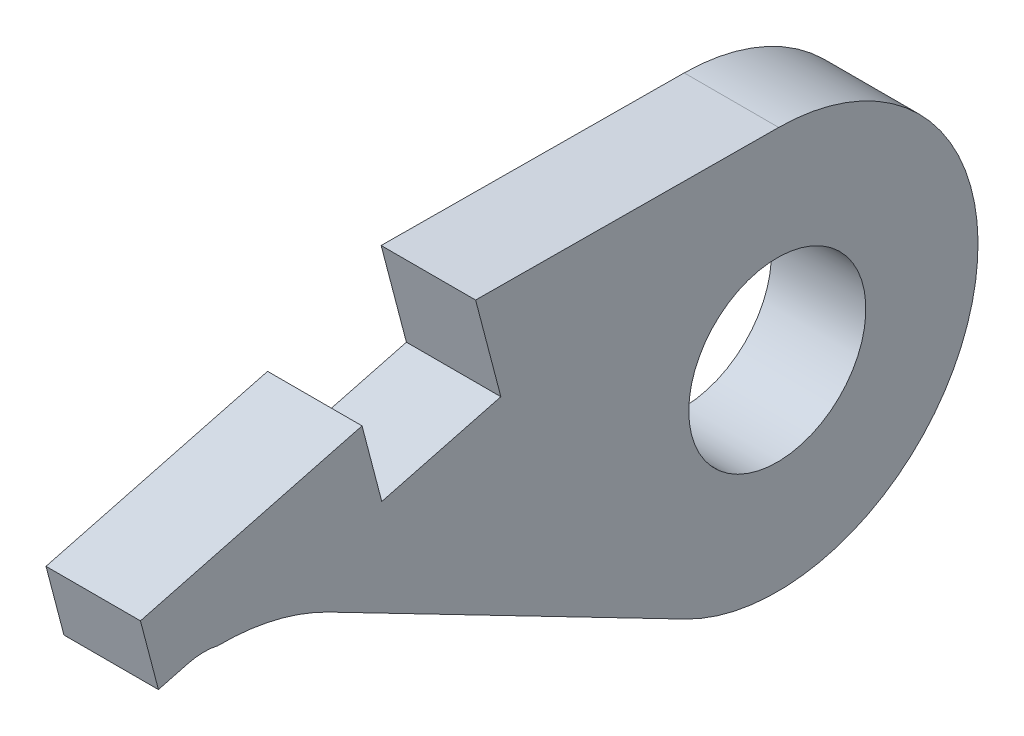
ISO-10303-21;
HEADER;
FILE_DESCRIPTION(('STEP AP214'),'2;1');
FILE_NAME('part.step','',(''),(''),'','','');
FILE_SCHEMA(('AUTOMOTIVE_DESIGN { 1 0 10303 214 1 1 1 1 }'));
ENDSEC;
DATA;
#1=APPLICATION_CONTEXT('core data for automotive mechanical design processes');
#2=APPLICATION_PROTOCOL_DEFINITION('international standard','automotive_design',2000,#1);
#3=PRODUCT_CONTEXT('',#1,'mechanical');
#4=PRODUCT('Part','Part','',(#3));
#5=PRODUCT_RELATED_PRODUCT_CATEGORY('part','',(#4));
#6=PRODUCT_DEFINITION_FORMATION('','',#4);
#7=PRODUCT_DEFINITION_CONTEXT('part definition',#1,'design');
#8=PRODUCT_DEFINITION('design','',#6,#7);
#9=PRODUCT_DEFINITION_SHAPE('','',#8);
#10=(LENGTH_UNIT() NAMED_UNIT(*) SI_UNIT(.MILLI.,.METRE.));
#11=(NAMED_UNIT(*) PLANE_ANGLE_UNIT() SI_UNIT($,.RADIAN.));
#12=(NAMED_UNIT(*) SI_UNIT($,.STERADIAN.) SOLID_ANGLE_UNIT());
#13=UNCERTAINTY_MEASURE_WITH_UNIT(LENGTH_MEASURE(1.E-05),#10,'distance_accuracy_value','');
#14=(GEOMETRIC_REPRESENTATION_CONTEXT(3) GLOBAL_UNCERTAINTY_ASSIGNED_CONTEXT((#13)) GLOBAL_UNIT_ASSIGNED_CONTEXT((#10,
#11,#12)) REPRESENTATION_CONTEXT('',''));
#15=CARTESIAN_POINT('',(0.,0.,0.));
#16=DIRECTION('',(0.,0.,1.));
#17=DIRECTION('',(1.,0.,0.));
#18=AXIS2_PLACEMENT_3D('',#15,#16,#17);
#19=CARTESIAN_POINT('',(-316.6,-79.0881001747443,-30.7514619286567));
#20=DIRECTION('',(0.,-0.253478701561643,0.967340967733005));
#21=DIRECTION('',(0.,-0.967340967733003,-0.253478701561644));
#22=AXIS2_PLACEMENT_3D('',#19,#20,#21);
#23=PLANE('',#22);
#24=DIRECTION('',(-1.,0.,0.));
#25=VECTOR('',#24,1.);
#26=CARTESIAN_POINT('',(-312.6,-75.8958749812254,-29.9149822135033));
#27=LINE('',#26,#25);
#28=CARTESIAN_POINT('',(-312.6,-75.8958749812254,-29.9149822135033));
#29=VERTEX_POINT('',#28);
#30=CARTESIAN_POINT('',(-316.6,-75.8958749812254,-29.9149822135033));
#31=VERTEX_POINT('',#30);
#32=EDGE_CURVE('E118',#29,#31,#27,.T.);
#33=ORIENTED_EDGE('',*,*,#32,.F.);
#34=DIRECTION('',(0.,0.967340967733003,0.253478701561644));
#35=VECTOR('',#34,1.);
#36=CARTESIAN_POINT('',(-312.6,-79.0881001747443,-30.7514619286567));
#37=LINE('',#36,#35);
#38=CARTESIAN_POINT('',(-312.6,-79.0881001747443,-30.7514619286567));
#39=VERTEX_POINT('',#38);
#40=EDGE_CURVE('E136',#39,#29,#37,.T.);
#41=ORIENTED_EDGE('',*,*,#40,.F.);
#42=DIRECTION('',(1.,0.,0.));
#43=VECTOR('',#42,1.);
#44=CARTESIAN_POINT('',(-316.6,-79.0881001747443,-30.7514619286567));
#45=LINE('',#44,#43);
#46=CARTESIAN_POINT('',(-316.6,-79.0881001747443,-30.7514619286567));
#47=VERTEX_POINT('',#46);
#48=EDGE_CURVE('E135',#47,#39,#45,.T.);
#49=ORIENTED_EDGE('',*,*,#48,.F.);
#50=DIRECTION('',(0.,0.967340967733003,0.253478701561644));
#51=VECTOR('',#50,1.);
#52=CARTESIAN_POINT('',(-316.6,-79.0881001747443,-30.7514619286567));
#53=LINE('',#52,#51);
#54=EDGE_CURVE('E131',#47,#31,#53,.T.);
#55=ORIENTED_EDGE('',*,*,#54,.T.);
#56=EDGE_LOOP('',(#33,#41,#49,#55));
#57=FACE_BOUND('',#56,.T.);
#58=ADVANCED_FACE('F37',(#57),#23,.F.);
#59=CARTESIAN_POINT('',(-312.6,-81.5468435798922,-21.3682545416465));
#60=DIRECTION('',(0.,0.253478701561643,-0.967340967733005));
#61=DIRECTION('',(0.,0.967340967733003,0.253478701561644));
#62=AXIS2_PLACEMENT_3D('',#59,#60,#61);
#63=PLANE('',#62);
#64=DIRECTION('',(1.,0.,0.));
#65=VECTOR('',#64,1.);
#66=CARTESIAN_POINT('',(-316.6,-78.3546183863733,-20.5317748264931));
#67=LINE('',#66,#65);
#68=CARTESIAN_POINT('',(-316.6,-78.3546183863733,-20.5317748264931));
#69=VERTEX_POINT('',#68);
#70=CARTESIAN_POINT('',(-312.6,-78.3546183863733,-20.5317748264931));
#71=VERTEX_POINT('',#70);
#72=EDGE_CURVE('E52',#69,#71,#67,.T.);
#73=ORIENTED_EDGE('',*,*,#72,.F.);
#74=DIRECTION('',(0.,0.967340967733003,0.253478701561644));
#75=VECTOR('',#74,1.);
#76=CARTESIAN_POINT('',(-316.6,-81.5468435798922,-21.3682545416465));
#77=LINE('',#76,#75);
#78=CARTESIAN_POINT('',(-316.6,-81.2566412895722,-21.292210931178));
#79=VERTEX_POINT('',#78);
#80=EDGE_CURVE('E59',#79,#69,#77,.T.);
#81=ORIENTED_EDGE('',*,*,#80,.F.);
#82=DIRECTION('',(-1.,0.,0.));
#83=VECTOR('',#82,1.);
#84=CARTESIAN_POINT('',(-245.763267940061,-81.2566412895722,-21.292210931178));
#85=LINE('',#84,#83);
#86=CARTESIAN_POINT('',(-312.6,-81.2566412895723,-21.292210931178));
#87=VERTEX_POINT('',#86);
#88=EDGE_CURVE('E157',#87,#79,#85,.T.);
#89=ORIENTED_EDGE('',*,*,#88,.F.);
#90=DIRECTION('',(0.,0.967340967733003,0.253478701561644));
#91=VECTOR('',#90,1.);
#92=CARTESIAN_POINT('',(-312.6,-81.5468435798922,-21.3682545416465));
#93=LINE('',#92,#91);
#94=EDGE_CURVE('E140',#87,#71,#93,.T.);
#95=ORIENTED_EDGE('',*,*,#94,.T.);
#96=EDGE_LOOP('',(#73,#81,#89,#95));
#97=FACE_BOUND('',#96,.T.);
#98=ADVANCED_FACE('F241',(#97),#63,.F.);
#99=CARTESIAN_POINT('',(-316.6,-82.272413359522,-47.4999999999995));
#100=DIRECTION('',(-1.,0.,0.));
#101=DIRECTION('',(0.,0.,1.));
#102=AXIS2_PLACEMENT_3D('',#99,#100,#101);
#103=PLANE('',#102);
#104=CARTESIAN_POINT('',(-316.6,-82.272413359522,-47.4999999999995));
#105=DIRECTION('',(-1.,0.,0.));
#106=DIRECTION('',(0.,0.,1.));
#107=AXIS2_PLACEMENT_3D('',#104,#105,#106);
#108=CIRCLE('',#107,3.75000000000001);
#109=CARTESIAN_POINT('',(-316.6,-82.272413359522,-43.7499999999995));
#110=VERTEX_POINT('',#109);
#111=EDGE_CURVE('E165',#110,#110,#108,.T.);
#112=ORIENTED_EDGE('',*,*,#111,.F.);
#113=EDGE_LOOP('',(#112));
#114=FACE_BOUND('',#113,.T.);
#115=ORIENTED_EDGE('',*,*,#80,.T.);
#116=DIRECTION('',(0.,-0.253478701561645,0.967340967733003));
#117=VECTOR('',#116,1.);
#118=CARTESIAN_POINT('',(-316.6,-75.8958749812254,-29.9149822135033));
#119=LINE('',#118,#117);
#120=EDGE_CURVE('E121',#31,#69,#119,.T.);
#121=ORIENTED_EDGE('',*,*,#120,.F.);
#122=ORIENTED_EDGE('',*,*,#54,.F.);
#123=DIRECTION('',(0.,-0.253478701561643,0.967340967733005));
#124=VECTOR('',#123,1.);
#125=CARTESIAN_POINT('',(-316.6,-75.1859498174999,-45.6430874560128));
#126=LINE('',#125,#124);
#127=CARTESIAN_POINT('',(-316.6,-77.7668432160323,-35.7937237723151));
#128=VERTEX_POINT('',#127);
#129=EDGE_CURVE('E147',#128,#47,#126,.T.);
#130=ORIENTED_EDGE('',*,*,#129,.F.);
#131=DIRECTION('',(0.,0.967340967733003,0.253478701561644));
#132=VECTOR('',#131,1.);
#133=CARTESIAN_POINT('',(-316.6,-84.8533067580544,-37.6506363163018));
#134=LINE('',#133,#132);
#135=CARTESIAN_POINT('',(-316.6,-73.685431134597,-34.7242445819891));
#136=VERTEX_POINT('',#135);
#137=EDGE_CURVE('E11',#128,#136,#134,.T.);
#138=ORIENTED_EDGE('',*,*,#137,.T.);
#139=DIRECTION('',(0.,-0.00679287483221677,-0.999976928159604));
#140=VECTOR('',#139,1.);
#141=CARTESIAN_POINT('',(-316.6,-73.6833206652489,-34.4135630652801));
#142=LINE('',#141,#140);
#143=CARTESIAN_POINT('',(-316.6,-73.7726094701653,-47.5577394360733));
#144=VERTEX_POINT('',#143);
#145=EDGE_CURVE('E182',#136,#144,#142,.T.);
#146=ORIENTED_EDGE('',*,*,#145,.T.);
#147=CARTESIAN_POINT('',(-316.6,-82.272413359522,-47.4999999999995));
#148=DIRECTION('',(-1.,0.,0.));
#149=DIRECTION('',(0.,0.,1.));
#150=AXIS2_PLACEMENT_3D('',#147,#148,#149);
#151=CIRCLE('',#150,8.50000000000001);
#152=CARTESIAN_POINT('',(-316.6,-89.8228577595626,-43.5960546415326));
#153=VERTEX_POINT('',#152);
#154=EDGE_CURVE('E184',#144,#153,#151,.T.);
#155=ORIENTED_EDGE('',*,*,#154,.T.);
#156=DIRECTION('',(0.,0.459287689231397,0.88828757647537));
#157=VECTOR('',#156,1.);
#158=CARTESIAN_POINT('',(-316.6,-82.0232489787974,-28.5111835601495));
#159=LINE('',#158,#157);
#160=CARTESIAN_POINT('',(-316.6,-82.0232489787974,-28.5111835601495));
#161=VERTEX_POINT('',#160);
#162=EDGE_CURVE('E187',#153,#161,#159,.T.);
#163=ORIENTED_EDGE('',*,*,#162,.T.);
#164=CARTESIAN_POINT('',(-316.6,-90.9061247435511,-23.9183066678356));
#165=DIRECTION('',(1.,0.,0.));
#166=DIRECTION('',(0.,0.,-1.));
#167=AXIS2_PLACEMENT_3D('',#164,#165,#166);
#168=CIRCLE('',#167,9.99999999999999);
#169=CARTESIAN_POINT('',(-316.6,-80.9066981729876,-23.8112167060803));
#170=VERTEX_POINT('',#169);
#171=EDGE_CURVE('E166',#161,#170,#168,.T.);
#172=ORIENTED_EDGE('',*,*,#171,.T.);
#173=CARTESIAN_POINT('',(-316.6,-83.4389089915924,-23.2213791266226));
#174=DIRECTION('',(-1.,0.,0.));
#175=DIRECTION('',(0.,0.,1.));
#176=AXIS2_PLACEMENT_3D('',#173,#174,#175);
#177=CIRCLE('',#176,2.6);
#178=CARTESIAN_POINT('',(-316.6,-80.9238224754866,-22.5623345025624));
#179=VERTEX_POINT('',#178);
#180=EDGE_CURVE('E162',#170,#179,#177,.F.);
#181=ORIENTED_EDGE('',*,*,#180,.T.);
#182=DIRECTION('',(0.,-0.253478701561643,0.967340967733005));
#183=VECTOR('',#182,1.);
#184=CARTESIAN_POINT('',(-316.6,-77.5526845361809,-35.4274778715267));
#185=LINE('',#184,#183);
#186=EDGE_CURVE('E145',#179,#79,#185,.T.);
#187=ORIENTED_EDGE('',*,*,#186,.T.);
#188=EDGE_LOOP('',(#115,#121,#122,#130,#138,#146,#155,#163,#172,#181,#187));
#189=FACE_BOUND('',#188,.T.);
#190=ADVANCED_FACE('F129',(#114,#189),#103,.T.);
#191=CARTESIAN_POINT('',(-312.6,-82.272413359522,-47.4999999999995));
#192=DIRECTION('',(-1.,0.,0.));
#193=DIRECTION('',(0.,0.,1.));
#194=AXIS2_PLACEMENT_3D('',#191,#192,#193);
#195=PLANE('',#194);
#196=CARTESIAN_POINT('',(-312.6,-82.272413359522,-47.4999999999995));
#197=DIRECTION('',(-1.,0.,0.));
#198=DIRECTION('',(0.,0.,1.));
#199=AXIS2_PLACEMENT_3D('',#196,#197,#198);
#200=CIRCLE('',#199,3.75000000000001);
#201=CARTESIAN_POINT('',(-312.6,-82.272413359522,-43.7499999999995));
#202=VERTEX_POINT('',#201);
#203=EDGE_CURVE('E160',#202,#202,#200,.T.);
#204=ORIENTED_EDGE('',*,*,#203,.T.);
#205=EDGE_LOOP('',(#204));
#206=FACE_BOUND('',#205,.T.);
#207=DIRECTION('',(0.,0.253478701561646,-0.967340967733003));
#208=VECTOR('',#207,1.);
#209=CARTESIAN_POINT('',(-312.6,-78.3546183863733,-20.5317748264931));
#210=LINE('',#209,#208);
#211=EDGE_CURVE('E122',#71,#29,#210,.T.);
#212=ORIENTED_EDGE('',*,*,#211,.F.);
#213=ORIENTED_EDGE('',*,*,#94,.F.);
#214=DIRECTION('',(0.,0.253478701561643,-0.967340967733005));
#215=VECTOR('',#214,1.);
#216=CARTESIAN_POINT('',(-312.6,-77.5526845361809,-35.4274778715267));
#217=LINE('',#216,#215);
#218=CARTESIAN_POINT('',(-312.6,-80.9238224754866,-22.5623345025624));
#219=VERTEX_POINT('',#218);
#220=EDGE_CURVE('E138',#87,#219,#217,.T.);
#221=ORIENTED_EDGE('',*,*,#220,.T.);
#222=CARTESIAN_POINT('',(-312.6,-83.4389089915924,-23.2213791266226));
#223=DIRECTION('',(-1.,0.,0.));
#224=DIRECTION('',(0.,0.,1.));
#225=AXIS2_PLACEMENT_3D('',#222,#223,#224);
#226=CIRCLE('',#225,2.6);
#227=CARTESIAN_POINT('',(-312.6,-80.9066981729876,-23.8112167060803));
#228=VERTEX_POINT('',#227);
#229=EDGE_CURVE('E158',#219,#228,#226,.T.);
#230=ORIENTED_EDGE('',*,*,#229,.T.);
#231=CARTESIAN_POINT('',(-312.6,-90.9061247435511,-23.9183066678356));
#232=DIRECTION('',(1.,0.,0.));
#233=DIRECTION('',(0.,0.,-1.));
#234=AXIS2_PLACEMENT_3D('',#231,#232,#233);
#235=CIRCLE('',#234,9.99999999999999);
#236=CARTESIAN_POINT('',(-312.6,-82.0232489787974,-28.5111835601495));
#237=VERTEX_POINT('',#236);
#238=EDGE_CURVE('E181',#237,#228,#235,.T.);
#239=ORIENTED_EDGE('',*,*,#238,.F.);
#240=DIRECTION('',(0.,0.459287689231397,0.88828757647537));
#241=VECTOR('',#240,1.);
#242=CARTESIAN_POINT('',(-312.6,-82.0232489787974,-28.5111835601495));
#243=LINE('',#242,#241);
#244=CARTESIAN_POINT('',(-312.6,-89.8228577595626,-43.5960546415326));
#245=VERTEX_POINT('',#244);
#246=EDGE_CURVE('E177',#245,#237,#243,.T.);
#247=ORIENTED_EDGE('',*,*,#246,.F.);
#248=CARTESIAN_POINT('',(-312.6,-82.272413359522,-47.4999999999995));
#249=DIRECTION('',(-1.,0.,0.));
#250=DIRECTION('',(0.,0.,1.));
#251=AXIS2_PLACEMENT_3D('',#248,#249,#250);
#252=CIRCLE('',#251,8.50000000000001);
#253=CARTESIAN_POINT('',(-312.6,-73.7726094701653,-47.5577394360733));
#254=VERTEX_POINT('',#253);
#255=EDGE_CURVE('E170',#254,#245,#252,.T.);
#256=ORIENTED_EDGE('',*,*,#255,.F.);
#257=DIRECTION('',(0.,-0.00679287483221677,-0.999976928159604));
#258=VECTOR('',#257,1.);
#259=CARTESIAN_POINT('',(-312.6,-73.6833206652489,-34.4135630652801));
#260=LINE('',#259,#258);
#261=CARTESIAN_POINT('',(-312.6,-73.685431134597,-34.7242445819891));
#262=VERTEX_POINT('',#261);
#263=EDGE_CURVE('E175',#262,#254,#260,.T.);
#264=ORIENTED_EDGE('',*,*,#263,.F.);
#265=DIRECTION('',(0.,0.967340967733003,0.253478701561644));
#266=VECTOR('',#265,1.);
#267=CARTESIAN_POINT('',(-312.6,-84.8533067580544,-37.6506363163018));
#268=LINE('',#267,#266);
#269=CARTESIAN_POINT('',(-312.6,-77.7668432160323,-35.7937237723151));
#270=VERTEX_POINT('',#269);
#271=EDGE_CURVE('E155',#270,#262,#268,.T.);
#272=ORIENTED_EDGE('',*,*,#271,.F.);
#273=DIRECTION('',(0.,-0.253478701561643,0.967340967733005));
#274=VECTOR('',#273,1.);
#275=CARTESIAN_POINT('',(-312.6,-75.1859498174999,-45.6430874560128));
#276=LINE('',#275,#274);
#277=EDGE_CURVE('E149',#270,#39,#276,.T.);
#278=ORIENTED_EDGE('',*,*,#277,.T.);
#279=ORIENTED_EDGE('',*,*,#40,.T.);
#280=EDGE_LOOP('',(#212,#213,#221,#230,#239,#247,#256,#264,#272,#278,#279));
#281=FACE_BOUND('',#280,.T.);
#282=ADVANCED_FACE('F214',(#206,#281),#195,.F.);
#283=CARTESIAN_POINT('',(-312.6,-82.272413359522,-47.4999999999995));
#284=DIRECTION('',(-1.,0.,0.));
#285=DIRECTION('',(0.,0.,1.));
#286=AXIS2_PLACEMENT_3D('',#283,#284,#285);
#287=CYLINDRICAL_SURFACE('',#286,3.75000000000001);
#288=ORIENTED_EDGE('',*,*,#203,.F.);
#289=EDGE_LOOP('',(#288));
#290=FACE_BOUND('',#289,.T.);
#291=ORIENTED_EDGE('',*,*,#111,.T.);
#292=EDGE_LOOP('',(#291));
#293=FACE_BOUND('',#292,.T.);
#294=ADVANCED_FACE('F39',(#290,#293),#287,.F.);
#295=CARTESIAN_POINT('',(-245.763267940061,-77.5526845361809,-35.4274778715267));
#296=DIRECTION('',(0.,-0.967340967733003,-0.253478701561644));
#297=DIRECTION('',(0.,0.253478701561643,-0.967340967733005));
#298=AXIS2_PLACEMENT_3D('',#295,#296,#297);
#299=PLANE('',#298);
#300=ORIENTED_EDGE('',*,*,#186,.F.);
#301=DIRECTION('',(1.,0.,0.));
#302=VECTOR('',#301,1.);
#303=CARTESIAN_POINT('',(-312.6,-80.9238224754866,-22.5623345025624));
#304=LINE('',#303,#302);
#305=EDGE_CURVE('E167',#179,#219,#304,.T.);
#306=ORIENTED_EDGE('',*,*,#305,.T.);
#307=ORIENTED_EDGE('',*,*,#220,.F.);
#308=ORIENTED_EDGE('',*,*,#88,.T.);
#309=EDGE_LOOP('',(#300,#306,#307,#308));
#310=FACE_BOUND('',#309,.T.);
#311=ADVANCED_FACE('F244',(#310),#299,.T.);
#312=CARTESIAN_POINT('',(-312.6,-83.4389089915924,-23.2213791266226));
#313=DIRECTION('',(-1.,0.,0.));
#314=DIRECTION('',(0.,0.,1.));
#315=AXIS2_PLACEMENT_3D('',#312,#313,#314);
#316=CYLINDRICAL_SURFACE('',#315,2.6);
#317=ORIENTED_EDGE('',*,*,#229,.F.);
#318=ORIENTED_EDGE('',*,*,#305,.F.);
#319=ORIENTED_EDGE('',*,*,#180,.F.);
#320=DIRECTION('',(-1.,0.,0.));
#321=VECTOR('',#320,1.);
#322=CARTESIAN_POINT('',(-312.6,-80.9066981729876,-23.8112167060803));
#323=LINE('',#322,#321);
#324=EDGE_CURVE('E45',#170,#228,#323,.F.);
#325=ORIENTED_EDGE('',*,*,#324,.T.);
#326=EDGE_LOOP('',(#317,#318,#319,#325));
#327=FACE_BOUND('',#326,.T.);
#328=ADVANCED_FACE('F206',(#327),#316,.F.);
#329=CARTESIAN_POINT('',(-312.6,-90.9061247435511,-23.9183066678356));
#330=DIRECTION('',(-1.,0.,0.));
#331=DIRECTION('',(0.,0.,1.));
#332=AXIS2_PLACEMENT_3D('',#329,#330,#331);
#333=CYLINDRICAL_SURFACE('',#332,9.99999999999999);
#334=ORIENTED_EDGE('',*,*,#324,.F.);
#335=ORIENTED_EDGE('',*,*,#171,.F.);
#336=DIRECTION('',(-1.,0.,0.));
#337=VECTOR('',#336,1.);
#338=CARTESIAN_POINT('',(-312.6,-82.0232489787974,-28.5111835601495));
#339=LINE('',#338,#337);
#340=EDGE_CURVE('E161',#237,#161,#339,.T.);
#341=ORIENTED_EDGE('',*,*,#340,.F.);
#342=ORIENTED_EDGE('',*,*,#238,.T.);
#343=EDGE_LOOP('',(#334,#335,#341,#342));
#344=FACE_BOUND('',#343,.T.);
#345=ADVANCED_FACE('F210',(#344),#333,.F.);
#346=CARTESIAN_POINT('',(-312.6,-82.0232489787974,-28.5111835601495));
#347=DIRECTION('',(0.,-0.888287576475368,0.459287689231397));
#348=DIRECTION('',(0.,-0.459287689231397,-0.88828757647537));
#349=AXIS2_PLACEMENT_3D('',#346,#347,#348);
#350=PLANE('',#349);
#351=ORIENTED_EDGE('',*,*,#162,.F.);
#352=DIRECTION('',(-1.,0.,0.));
#353=VECTOR('',#352,1.);
#354=CARTESIAN_POINT('',(-312.6,-89.8228577595626,-43.5960546415326));
#355=LINE('',#354,#353);
#356=EDGE_CURVE('E173',#245,#153,#355,.T.);
#357=ORIENTED_EDGE('',*,*,#356,.F.);
#358=ORIENTED_EDGE('',*,*,#246,.T.);
#359=ORIENTED_EDGE('',*,*,#340,.T.);
#360=EDGE_LOOP('',(#351,#357,#358,#359));
#361=FACE_BOUND('',#360,.T.);
#362=ADVANCED_FACE('F218',(#361),#350,.T.);
#363=CARTESIAN_POINT('',(-312.6,-82.272413359522,-47.4999999999995));
#364=DIRECTION('',(-1.,0.,0.));
#365=DIRECTION('',(0.,0.,1.));
#366=AXIS2_PLACEMENT_3D('',#363,#364,#365);
#367=CYLINDRICAL_SURFACE('',#366,8.50000000000001);
#368=ORIENTED_EDGE('',*,*,#154,.F.);
#369=DIRECTION('',(-1.,0.,0.));
#370=VECTOR('',#369,1.);
#371=CARTESIAN_POINT('',(-312.6,-73.7726094701653,-47.5577394360733));
#372=LINE('',#371,#370);
#373=EDGE_CURVE('E178',#254,#144,#372,.T.);
#374=ORIENTED_EDGE('',*,*,#373,.F.);
#375=ORIENTED_EDGE('',*,*,#255,.T.);
#376=ORIENTED_EDGE('',*,*,#356,.T.);
#377=EDGE_LOOP('',(#368,#374,#375,#376));
#378=FACE_BOUND('',#377,.T.);
#379=ADVANCED_FACE('F221',(#378),#367,.T.);
#380=CARTESIAN_POINT('',(-312.6,-73.6833206652489,-34.4135630652801));
#381=DIRECTION('',(0.,0.999976928159602,-0.00679287483221619));
#382=DIRECTION('',(0.,0.00679287483221674,0.999976928159604));
#383=AXIS2_PLACEMENT_3D('',#380,#381,#382);
#384=PLANE('',#383);
#385=ORIENTED_EDGE('',*,*,#145,.F.);
#386=DIRECTION('',(1.,0.,0.));
#387=VECTOR('',#386,1.);
#388=CARTESIAN_POINT('',(-312.6,-73.685431134597,-34.7242445819891));
#389=LINE('',#388,#387);
#390=EDGE_CURVE('E152',#136,#262,#389,.T.);
#391=ORIENTED_EDGE('',*,*,#390,.T.);
#392=ORIENTED_EDGE('',*,*,#263,.T.);
#393=ORIENTED_EDGE('',*,*,#373,.T.);
#394=EDGE_LOOP('',(#385,#391,#392,#393));
#395=FACE_BOUND('',#394,.T.);
#396=ADVANCED_FACE('F227',(#395),#384,.T.);
#397=CARTESIAN_POINT('',(0.,-81.5468435798922,-21.3682545416465));
#398=DIRECTION('',(0.,-0.967340967733003,-0.253478701561644));
#399=DIRECTION('',(0.,0.253478701561643,-0.967340967733005));
#400=AXIS2_PLACEMENT_3D('',#397,#398,#399);
#401=PLANE('',#400);
#402=ORIENTED_EDGE('',*,*,#277,.F.);
#403=DIRECTION('',(1.,0.,0.));
#404=VECTOR('',#403,1.);
#405=CARTESIAN_POINT('',(-330.701333630157,-77.7668432160323,-35.7937237723151));
#406=LINE('',#405,#404);
#407=EDGE_CURVE('E233',#128,#270,#406,.T.);
#408=ORIENTED_EDGE('',*,*,#407,.F.);
#409=ORIENTED_EDGE('',*,*,#129,.T.);
#410=ORIENTED_EDGE('',*,*,#48,.T.);
#411=EDGE_LOOP('',(#402,#408,#409,#410));
#412=FACE_BOUND('',#411,.T.);
#413=ADVANCED_FACE('F234',(#412),#401,.F.);
#414=CARTESIAN_POINT('',(-325.283123024896,-131.109954470018,-49.7715692569392));
#415=DIRECTION('',(0.,-0.253478701561643,0.967340967733005));
#416=DIRECTION('',(0.,-0.967340967733003,-0.253478701561644));
#417=AXIS2_PLACEMENT_3D('',#414,#415,#416);
#418=PLANE('',#417);
#419=ORIENTED_EDGE('',*,*,#271,.T.);
#420=ORIENTED_EDGE('',*,*,#390,.F.);
#421=ORIENTED_EDGE('',*,*,#137,.F.);
#422=ORIENTED_EDGE('',*,*,#407,.T.);
#423=EDGE_LOOP('',(#419,#420,#421,#422));
#424=FACE_BOUND('',#423,.T.);
#425=ADVANCED_FACE('F229',(#424),#418,.T.);
#426=CARTESIAN_POINT('',(1.98136581078626E-13,-78.3546183863726,-20.531774826493));
#427=DIRECTION('',(0.,0.967340967733003,0.253478701561645));
#428=DIRECTION('',(0.,-0.253478701561645,0.967340967733003));
#429=AXIS2_PLACEMENT_3D('',#426,#427,#428);
#430=PLANE('',#429);
#431=ORIENTED_EDGE('',*,*,#32,.T.);
#432=ORIENTED_EDGE('',*,*,#120,.T.);
#433=ORIENTED_EDGE('',*,*,#72,.T.);
#434=ORIENTED_EDGE('',*,*,#211,.T.);
#435=EDGE_LOOP('',(#431,#432,#433,#434));
#436=FACE_BOUND('',#435,.T.);
#437=ADVANCED_FACE('F120',(#436),#430,.T.);
#438=CLOSED_SHELL('',(#58,#98,#190,#282,#294,#311,#328,#345,#362,#379,#396,#413,#425,#437));
#439=MANIFOLD_SOLID_BREP('B2',#438);
#440=ADVANCED_BREP_SHAPE_REPRESENTATION('',(#18,#439),#14);
#441=SHAPE_DEFINITION_REPRESENTATION(#9,#440);
ENDSEC;
END-ISO-10303-21;
